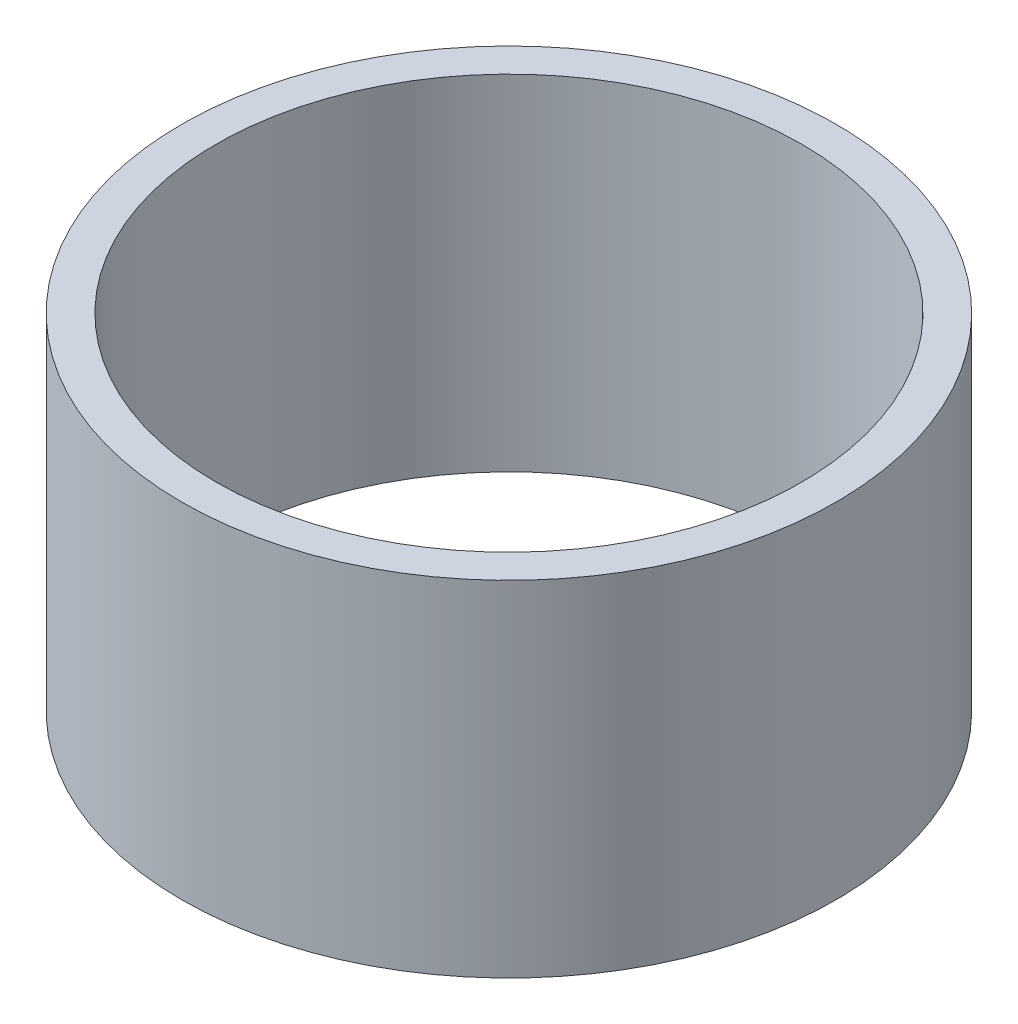
ISO-10303-21;
HEADER;
FILE_DESCRIPTION(('STEP AP214'),'2;1');
FILE_NAME('part.step','',(''),(''),'','','');
FILE_SCHEMA(('AUTOMOTIVE_DESIGN { 1 0 10303 214 1 1 1 1 }'));
ENDSEC;
DATA;
#1=APPLICATION_CONTEXT('core data for automotive mechanical design processes');
#2=APPLICATION_PROTOCOL_DEFINITION('international standard','automotive_design',2000,#1);
#3=PRODUCT_CONTEXT('',#1,'mechanical');
#4=PRODUCT('Part','Part','',(#3));
#5=PRODUCT_RELATED_PRODUCT_CATEGORY('part','',(#4));
#6=PRODUCT_DEFINITION_FORMATION('','',#4);
#7=PRODUCT_DEFINITION_CONTEXT('part definition',#1,'design');
#8=PRODUCT_DEFINITION('design','',#6,#7);
#9=PRODUCT_DEFINITION_SHAPE('','',#8);
#10=(LENGTH_UNIT() NAMED_UNIT(*) SI_UNIT(.MILLI.,.METRE.));
#11=(NAMED_UNIT(*) PLANE_ANGLE_UNIT() SI_UNIT($,.RADIAN.));
#12=(NAMED_UNIT(*) SI_UNIT($,.STERADIAN.) SOLID_ANGLE_UNIT());
#13=UNCERTAINTY_MEASURE_WITH_UNIT(LENGTH_MEASURE(1.E-05),#10,'distance_accuracy_value','');
#14=(GEOMETRIC_REPRESENTATION_CONTEXT(3) GLOBAL_UNCERTAINTY_ASSIGNED_CONTEXT((#13)) GLOBAL_UNIT_ASSIGNED_CONTEXT((#10,
#11,#12)) REPRESENTATION_CONTEXT('',''));
#15=CARTESIAN_POINT('',(0.,0.,0.));
#16=DIRECTION('',(0.,0.,1.));
#17=DIRECTION('',(1.,0.,0.));
#18=AXIS2_PLACEMENT_3D('',#15,#16,#17);
#19=CARTESIAN_POINT('',(0.,50.8,0.));
#20=DIRECTION('',(0.,-1.,0.));
#21=DIRECTION('',(0.,0.,-1.));
#22=AXIS2_PLACEMENT_3D('',#19,#20,#21);
#23=CYLINDRICAL_SURFACE('',#22,48.26);
#24=CARTESIAN_POINT('',(0.,50.8,0.));
#25=DIRECTION('',(0.,1.,0.));
#26=DIRECTION('',(0.,0.,1.));
#27=AXIS2_PLACEMENT_3D('',#24,#25,#26);
#28=CIRCLE('',#27,48.26);
#29=CARTESIAN_POINT('',(0.,50.8,48.26));
#30=VERTEX_POINT('',#29);
#31=EDGE_CURVE('E10',#30,#30,#28,.T.);
#32=ORIENTED_EDGE('',*,*,#31,.F.);
#33=EDGE_LOOP('',(#32));
#34=FACE_BOUND('',#33,.T.);
#35=CARTESIAN_POINT('',(0.,0.,0.));
#36=DIRECTION('',(0.,1.,0.));
#37=DIRECTION('',(0.,0.,1.));
#38=AXIS2_PLACEMENT_3D('',#35,#36,#37);
#39=CIRCLE('',#38,48.26);
#40=CARTESIAN_POINT('',(0.,0.,48.26));
#41=VERTEX_POINT('',#40);
#42=EDGE_CURVE('E35',#41,#41,#39,.T.);
#43=ORIENTED_EDGE('',*,*,#42,.T.);
#44=EDGE_LOOP('',(#43));
#45=FACE_BOUND('',#44,.T.);
#46=ADVANCED_FACE('F32',(#34,#45),#23,.T.);
#47=CARTESIAN_POINT('',(0.,50.8,0.));
#48=DIRECTION('',(0.,1.,0.));
#49=DIRECTION('',(0.,0.,1.));
#50=AXIS2_PLACEMENT_3D('',#47,#48,#49);
#51=PLANE('',#50);
#52=CARTESIAN_POINT('',(0.,50.8,0.));
#53=DIRECTION('',(0.,1.,0.));
#54=DIRECTION('',(0.,0.,1.));
#55=AXIS2_PLACEMENT_3D('',#52,#53,#54);
#56=CIRCLE('',#55,43.18);
#57=CARTESIAN_POINT('',(0.,50.8,43.18));
#58=VERTEX_POINT('',#57);
#59=EDGE_CURVE('E44',#58,#58,#56,.T.);
#60=ORIENTED_EDGE('',*,*,#59,.F.);
#61=EDGE_LOOP('',(#60));
#62=FACE_BOUND('',#61,.T.);
#63=ORIENTED_EDGE('',*,*,#31,.T.);
#64=EDGE_LOOP('',(#63));
#65=FACE_BOUND('',#64,.T.);
#66=ADVANCED_FACE('F59',(#62,#65),#51,.T.);
#67=CARTESIAN_POINT('',(0.,0.,0.));
#68=DIRECTION('',(0.,1.,0.));
#69=DIRECTION('',(0.,0.,1.));
#70=AXIS2_PLACEMENT_3D('',#67,#68,#69);
#71=PLANE('',#70);
#72=CARTESIAN_POINT('',(0.,0.,0.));
#73=DIRECTION('',(0.,1.,0.));
#74=DIRECTION('',(0.,0.,1.));
#75=AXIS2_PLACEMENT_3D('',#72,#73,#74);
#76=CIRCLE('',#75,43.18);
#77=CARTESIAN_POINT('',(0.,0.,43.18));
#78=VERTEX_POINT('',#77);
#79=EDGE_CURVE('E42',#78,#78,#76,.T.);
#80=ORIENTED_EDGE('',*,*,#79,.T.);
#81=EDGE_LOOP('',(#80));
#82=FACE_BOUND('',#81,.T.);
#83=ORIENTED_EDGE('',*,*,#42,.F.);
#84=EDGE_LOOP('',(#83));
#85=FACE_BOUND('',#84,.T.);
#86=ADVANCED_FACE('F50',(#82,#85),#71,.F.);
#87=CARTESIAN_POINT('',(0.,0.,0.));
#88=DIRECTION('',(0.,1.,0.));
#89=DIRECTION('',(0.,0.,1.));
#90=AXIS2_PLACEMENT_3D('',#87,#88,#89);
#91=CYLINDRICAL_SURFACE('',#90,43.18);
#92=ORIENTED_EDGE('',*,*,#79,.F.);
#93=EDGE_LOOP('',(#92));
#94=FACE_BOUND('',#93,.T.);
#95=ORIENTED_EDGE('',*,*,#59,.T.);
#96=EDGE_LOOP('',(#95));
#97=FACE_BOUND('',#96,.T.);
#98=ADVANCED_FACE('F53',(#94,#97),#91,.F.);
#99=CLOSED_SHELL('',(#46,#66,#86,#98));
#100=MANIFOLD_SOLID_BREP('B2',#99);
#101=ADVANCED_BREP_SHAPE_REPRESENTATION('',(#18,#100),#14);
#102=SHAPE_DEFINITION_REPRESENTATION(#9,#101);
ENDSEC;
END-ISO-10303-21;
